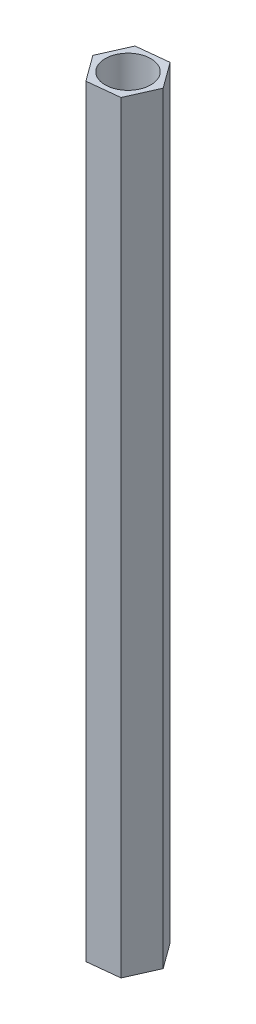
ISO-10303-21;
HEADER;
FILE_DESCRIPTION(('STEP AP214'),'2;1');
FILE_NAME('part.step','',(''),(''),'','','');
FILE_SCHEMA(('AUTOMOTIVE_DESIGN { 1 0 10303 214 1 1 1 1 }'));
ENDSEC;
DATA;
#1=APPLICATION_CONTEXT('core data for automotive mechanical design processes');
#2=APPLICATION_PROTOCOL_DEFINITION('international standard','automotive_design',2000,#1);
#3=PRODUCT_CONTEXT('',#1,'mechanical');
#4=PRODUCT('Part','Part','',(#3));
#5=PRODUCT_RELATED_PRODUCT_CATEGORY('part','',(#4));
#6=PRODUCT_DEFINITION_FORMATION('','',#4);
#7=PRODUCT_DEFINITION_CONTEXT('part definition',#1,'design');
#8=PRODUCT_DEFINITION('design','',#6,#7);
#9=PRODUCT_DEFINITION_SHAPE('','',#8);
#10=(LENGTH_UNIT() NAMED_UNIT(*) SI_UNIT(.MILLI.,.METRE.));
#11=(NAMED_UNIT(*) PLANE_ANGLE_UNIT() SI_UNIT($,.RADIAN.));
#12=(NAMED_UNIT(*) SI_UNIT($,.STERADIAN.) SOLID_ANGLE_UNIT());
#13=UNCERTAINTY_MEASURE_WITH_UNIT(LENGTH_MEASURE(1.E-05),#10,'distance_accuracy_value','');
#14=(GEOMETRIC_REPRESENTATION_CONTEXT(3) GLOBAL_UNCERTAINTY_ASSIGNED_CONTEXT((#13)) GLOBAL_UNIT_ASSIGNED_CONTEXT((#10,
#11,#12)) REPRESENTATION_CONTEXT('',''));
#15=CARTESIAN_POINT('',(0.,0.,0.));
#16=DIRECTION('',(0.,0.,1.));
#17=DIRECTION('',(1.,0.,0.));
#18=AXIS2_PLACEMENT_3D('',#15,#16,#17);
#19=CARTESIAN_POINT('',(0.,55.15,0.));
#20=DIRECTION('',(0.,1.,0.));
#21=DIRECTION('',(0.,0.,1.));
#22=AXIS2_PLACEMENT_3D('',#19,#20,#21);
#23=PLANE('',#22);
#24=DIRECTION('',(0.994280555265368,0.,-0.106799707027648));
#25=VECTOR('',#24,1.);
#26=CARTESIAN_POINT('',(-0.934496878409647,55.15,2.11188278973431));
#27=LINE('',#26,#25);
#28=CARTESIAN_POINT('',(-0.934496878409647,55.15,2.11188278973431));
#29=VERTEX_POINT('',#28);
#30=CARTESIAN_POINT('',(1.36169570652024,55.15,1.86523943132716));
#31=VERTEX_POINT('',#30);
#32=EDGE_CURVE('E129',#29,#31,#27,.T.);
#33=ORIENTED_EDGE('',*,*,#32,.T.);
#34=DIRECTION('',(0.404649018230006,0.,-0.91447207286253));
#35=VECTOR('',#34,1.);
#36=CARTESIAN_POINT('',(1.36169570652024,55.15,1.86523943132716));
#37=LINE('',#36,#35);
#38=CARTESIAN_POINT('',(2.29619258492988,55.15,-0.246643358407142));
#39=VERTEX_POINT('',#38);
#40=EDGE_CURVE('E87',#31,#39,#37,.T.);
#41=ORIENTED_EDGE('',*,*,#40,.T.);
#42=DIRECTION('',(-0.589631537035362,0.,-0.807672365834882));
#43=VECTOR('',#42,1.);
#44=CARTESIAN_POINT('',(2.29619258492988,55.15,-0.246643358407142));
#45=LINE('',#44,#43);
#46=CARTESIAN_POINT('',(0.934496878409646,55.15,-2.11188278973431));
#47=VERTEX_POINT('',#46);
#48=EDGE_CURVE('E100',#39,#47,#45,.T.);
#49=ORIENTED_EDGE('',*,*,#48,.T.);
#50=DIRECTION('',(-0.994280555265368,0.,0.106799707027648));
#51=VECTOR('',#50,1.);
#52=CARTESIAN_POINT('',(0.934496878409646,55.15,-2.11188278973431));
#53=LINE('',#52,#51);
#54=CARTESIAN_POINT('',(-1.36169570652024,55.15,-1.86523943132716));
#55=VERTEX_POINT('',#54);
#56=EDGE_CURVE('E94',#47,#55,#53,.T.);
#57=ORIENTED_EDGE('',*,*,#56,.T.);
#58=DIRECTION('',(-0.404649018230006,0.,0.91447207286253));
#59=VECTOR('',#58,1.);
#60=CARTESIAN_POINT('',(-1.36169570652024,55.15,-1.86523943132716));
#61=LINE('',#60,#59);
#62=CARTESIAN_POINT('',(-2.29619258492988,55.15,0.246643358407142));
#63=VERTEX_POINT('',#62);
#64=EDGE_CURVE('E98',#55,#63,#61,.T.);
#65=ORIENTED_EDGE('',*,*,#64,.T.);
#66=DIRECTION('',(0.589631537035362,0.,0.807672365834882));
#67=VECTOR('',#66,1.);
#68=CARTESIAN_POINT('',(-2.29619258492988,55.15,0.246643358407142));
#69=LINE('',#68,#67);
#70=EDGE_CURVE('E50',#63,#29,#69,.T.);
#71=ORIENTED_EDGE('',*,*,#70,.T.);
#72=EDGE_LOOP('',(#33,#41,#49,#57,#65,#71));
#73=FACE_BOUND('',#72,.T.);
#74=CARTESIAN_POINT('',(0.,55.15,0.));
#75=DIRECTION('',(0.,1.,0.));
#76=DIRECTION('',(0.,0.,1.));
#77=AXIS2_PLACEMENT_3D('',#74,#75,#76);
#78=CIRCLE('',#77,1.65);
#79=CARTESIAN_POINT('',(0.,55.15,1.65));
#80=VERTEX_POINT('',#79);
#81=EDGE_CURVE('E122',#80,#80,#78,.T.);
#82=ORIENTED_EDGE('',*,*,#81,.F.);
#83=EDGE_LOOP('',(#82));
#84=FACE_BOUND('',#83,.T.);
#85=ADVANCED_FACE('F33',(#73,#84),#23,.T.);
#86=CARTESIAN_POINT('',(0.,0.,0.));
#87=DIRECTION('',(0.,1.,0.));
#88=DIRECTION('',(0.,0.,1.));
#89=AXIS2_PLACEMENT_3D('',#86,#87,#88);
#90=PLANE('',#89);
#91=DIRECTION('',(0.994280555265368,0.,-0.106799707027648));
#92=VECTOR('',#91,1.);
#93=CARTESIAN_POINT('',(-0.934496878409647,0.,2.11188278973431));
#94=LINE('',#93,#92);
#95=CARTESIAN_POINT('',(-0.934496878409647,0.,2.11188278973431));
#96=VERTEX_POINT('',#95);
#97=CARTESIAN_POINT('',(1.36169570652024,0.,1.86523943132716));
#98=VERTEX_POINT('',#97);
#99=EDGE_CURVE('E118',#96,#98,#94,.T.);
#100=ORIENTED_EDGE('',*,*,#99,.F.);
#101=DIRECTION('',(0.589631537035362,0.,0.807672365834882));
#102=VECTOR('',#101,1.);
#103=CARTESIAN_POINT('',(-2.29619258492988,0.,0.246643358407142));
#104=LINE('',#103,#102);
#105=CARTESIAN_POINT('',(-2.29619258492988,0.,0.246643358407142));
#106=VERTEX_POINT('',#105);
#107=EDGE_CURVE('E79',#106,#96,#104,.T.);
#108=ORIENTED_EDGE('',*,*,#107,.F.);
#109=DIRECTION('',(-0.404649018230006,0.,0.91447207286253));
#110=VECTOR('',#109,1.);
#111=CARTESIAN_POINT('',(-1.36169570652024,0.,-1.86523943132716));
#112=LINE('',#111,#110);
#113=CARTESIAN_POINT('',(-1.36169570652024,0.,-1.86523943132716));
#114=VERTEX_POINT('',#113);
#115=EDGE_CURVE('E73',#114,#106,#112,.T.);
#116=ORIENTED_EDGE('',*,*,#115,.F.);
#117=DIRECTION('',(-0.994280555265368,0.,0.106799707027648));
#118=VECTOR('',#117,1.);
#119=CARTESIAN_POINT('',(0.934496878409646,0.,-2.11188278973431));
#120=LINE('',#119,#118);
#121=CARTESIAN_POINT('',(0.934496878409646,0.,-2.11188278973431));
#122=VERTEX_POINT('',#121);
#123=EDGE_CURVE('E108',#122,#114,#120,.T.);
#124=ORIENTED_EDGE('',*,*,#123,.F.);
#125=DIRECTION('',(-0.589631537035362,0.,-0.807672365834882));
#126=VECTOR('',#125,1.);
#127=CARTESIAN_POINT('',(2.29619258492988,0.,-0.246643358407142));
#128=LINE('',#127,#126);
#129=CARTESIAN_POINT('',(2.29619258492988,0.,-0.246643358407142));
#130=VERTEX_POINT('',#129);
#131=EDGE_CURVE('E124',#130,#122,#128,.T.);
#132=ORIENTED_EDGE('',*,*,#131,.F.);
#133=DIRECTION('',(0.404649018230006,0.,-0.91447207286253));
#134=VECTOR('',#133,1.);
#135=CARTESIAN_POINT('',(1.36169570652024,0.,1.86523943132716));
#136=LINE('',#135,#134);
#137=EDGE_CURVE('E121',#98,#130,#136,.T.);
#138=ORIENTED_EDGE('',*,*,#137,.F.);
#139=EDGE_LOOP('',(#100,#108,#116,#124,#132,#138));
#140=FACE_BOUND('',#139,.T.);
#141=CARTESIAN_POINT('',(0.,0.,0.));
#142=DIRECTION('',(0.,1.,0.));
#143=DIRECTION('',(0.,0.,1.));
#144=AXIS2_PLACEMENT_3D('',#141,#142,#143);
#145=CIRCLE('',#144,1.65);
#146=CARTESIAN_POINT('',(0.,0.,1.65));
#147=VERTEX_POINT('',#146);
#148=EDGE_CURVE('E222',#147,#147,#145,.T.);
#149=ORIENTED_EDGE('',*,*,#148,.T.);
#150=EDGE_LOOP('',(#149));
#151=FACE_BOUND('',#150,.T.);
#152=ADVANCED_FACE('F138',(#140,#151),#90,.F.);
#153=CARTESIAN_POINT('',(-0.934496878409647,55.15,2.11188278973431));
#154=DIRECTION('',(-0.106799707027648,0.,-0.994280555265368));
#155=DIRECTION('',(-0.994280555265368,0.,0.106799707027648));
#156=AXIS2_PLACEMENT_3D('',#153,#154,#155);
#157=PLANE('',#156);
#158=ORIENTED_EDGE('',*,*,#99,.T.);
#159=DIRECTION('',(0.,-1.,0.));
#160=VECTOR('',#159,1.);
#161=CARTESIAN_POINT('',(1.36169570652024,55.15,1.86523943132716));
#162=LINE('',#161,#160);
#163=EDGE_CURVE('E11',#31,#98,#162,.T.);
#164=ORIENTED_EDGE('',*,*,#163,.F.);
#165=ORIENTED_EDGE('',*,*,#32,.F.);
#166=DIRECTION('',(0.,-1.,0.));
#167=VECTOR('',#166,1.);
#168=CARTESIAN_POINT('',(-0.934496878409647,55.15,2.11188278973431));
#169=LINE('',#168,#167);
#170=EDGE_CURVE('E114',#29,#96,#169,.T.);
#171=ORIENTED_EDGE('',*,*,#170,.T.);
#172=EDGE_LOOP('',(#158,#164,#165,#171));
#173=FACE_BOUND('',#172,.T.);
#174=ADVANCED_FACE('F35',(#173),#157,.F.);
#175=CARTESIAN_POINT('',(1.36169570652024,55.15,1.86523943132716));
#176=DIRECTION('',(-0.91447207286253,0.,-0.404649018230006));
#177=DIRECTION('',(-0.404649018230006,0.,0.91447207286253));
#178=AXIS2_PLACEMENT_3D('',#175,#176,#177);
#179=PLANE('',#178);
#180=ORIENTED_EDGE('',*,*,#137,.T.);
#181=DIRECTION('',(0.,-1.,0.));
#182=VECTOR('',#181,1.);
#183=CARTESIAN_POINT('',(2.29619258492988,55.15,-0.246643358407142));
#184=LINE('',#183,#182);
#185=EDGE_CURVE('E42',#39,#130,#184,.T.);
#186=ORIENTED_EDGE('',*,*,#185,.F.);
#187=ORIENTED_EDGE('',*,*,#40,.F.);
#188=ORIENTED_EDGE('',*,*,#163,.T.);
#189=EDGE_LOOP('',(#180,#186,#187,#188));
#190=FACE_BOUND('',#189,.T.);
#191=ADVANCED_FACE('F163',(#190),#179,.F.);
#192=CARTESIAN_POINT('',(2.29619258492988,55.15,-0.246643358407142));
#193=DIRECTION('',(-0.807672365834882,0.,0.589631537035362));
#194=DIRECTION('',(0.589631537035362,0.,0.807672365834882));
#195=AXIS2_PLACEMENT_3D('',#192,#193,#194);
#196=PLANE('',#195);
#197=ORIENTED_EDGE('',*,*,#131,.T.);
#198=DIRECTION('',(0.,-1.,0.));
#199=VECTOR('',#198,1.);
#200=CARTESIAN_POINT('',(0.934496878409646,55.15,-2.11188278973431));
#201=LINE('',#200,#199);
#202=EDGE_CURVE('E109',#47,#122,#201,.T.);
#203=ORIENTED_EDGE('',*,*,#202,.F.);
#204=ORIENTED_EDGE('',*,*,#48,.F.);
#205=ORIENTED_EDGE('',*,*,#185,.T.);
#206=EDGE_LOOP('',(#197,#203,#204,#205));
#207=FACE_BOUND('',#206,.T.);
#208=ADVANCED_FACE('F135',(#207),#196,.F.);
#209=CARTESIAN_POINT('',(0.934496878409646,55.15,-2.11188278973431));
#210=DIRECTION('',(0.106799707027648,0.,0.994280555265368));
#211=DIRECTION('',(0.994280555265368,0.,-0.106799707027648));
#212=AXIS2_PLACEMENT_3D('',#209,#210,#211);
#213=PLANE('',#212);
#214=ORIENTED_EDGE('',*,*,#123,.T.);
#215=DIRECTION('',(0.,-1.,0.));
#216=VECTOR('',#215,1.);
#217=CARTESIAN_POINT('',(-1.36169570652024,55.15,-1.86523943132716));
#218=LINE('',#217,#216);
#219=EDGE_CURVE('E105',#55,#114,#218,.T.);
#220=ORIENTED_EDGE('',*,*,#219,.F.);
#221=ORIENTED_EDGE('',*,*,#56,.F.);
#222=ORIENTED_EDGE('',*,*,#202,.T.);
#223=EDGE_LOOP('',(#214,#220,#221,#222));
#224=FACE_BOUND('',#223,.T.);
#225=ADVANCED_FACE('F106',(#224),#213,.F.);
#226=CARTESIAN_POINT('',(-1.36169570652024,55.15,-1.86523943132716));
#227=DIRECTION('',(0.91447207286253,0.,0.404649018230006));
#228=DIRECTION('',(0.404649018230006,0.,-0.91447207286253));
#229=AXIS2_PLACEMENT_3D('',#226,#227,#228);
#230=PLANE('',#229);
#231=ORIENTED_EDGE('',*,*,#115,.T.);
#232=DIRECTION('',(0.,-1.,0.));
#233=VECTOR('',#232,1.);
#234=CARTESIAN_POINT('',(-2.29619258492988,55.15,0.246643358407142));
#235=LINE('',#234,#233);
#236=EDGE_CURVE('E110',#63,#106,#235,.T.);
#237=ORIENTED_EDGE('',*,*,#236,.F.);
#238=ORIENTED_EDGE('',*,*,#64,.F.);
#239=ORIENTED_EDGE('',*,*,#219,.T.);
#240=EDGE_LOOP('',(#231,#237,#238,#239));
#241=FACE_BOUND('',#240,.T.);
#242=ADVANCED_FACE('F112',(#241),#230,.F.);
#243=CARTESIAN_POINT('',(-2.29619258492988,55.15,0.246643358407142));
#244=DIRECTION('',(0.807672365834882,0.,-0.589631537035362));
#245=DIRECTION('',(-0.589631537035362,0.,-0.807672365834883));
#246=AXIS2_PLACEMENT_3D('',#243,#244,#245);
#247=PLANE('',#246);
#248=ORIENTED_EDGE('',*,*,#107,.T.);
#249=ORIENTED_EDGE('',*,*,#170,.F.);
#250=ORIENTED_EDGE('',*,*,#70,.F.);
#251=ORIENTED_EDGE('',*,*,#236,.T.);
#252=EDGE_LOOP('',(#248,#249,#250,#251));
#253=FACE_BOUND('',#252,.T.);
#254=ADVANCED_FACE('F143',(#253),#247,.F.);
#255=CARTESIAN_POINT('',(0.,55.15,0.));
#256=DIRECTION('',(0.,-1.,0.));
#257=DIRECTION('',(0.,0.,-1.));
#258=AXIS2_PLACEMENT_3D('',#255,#256,#257);
#259=CYLINDRICAL_SURFACE('',#258,1.65);
#260=ORIENTED_EDGE('',*,*,#81,.T.);
#261=EDGE_LOOP('',(#260));
#262=FACE_BOUND('',#261,.T.);
#263=ORIENTED_EDGE('',*,*,#148,.F.);
#264=EDGE_LOOP('',(#263));
#265=FACE_BOUND('',#264,.T.);
#266=ADVANCED_FACE('F145',(#262,#265),#259,.F.);
#267=CLOSED_SHELL('',(#85,#152,#174,#191,#208,#225,#242,#254,#266));
#268=MANIFOLD_SOLID_BREP('B2',#267);
#269=ADVANCED_BREP_SHAPE_REPRESENTATION('',(#18,#268),#14);
#270=SHAPE_DEFINITION_REPRESENTATION(#9,#269);
ENDSEC;
END-ISO-10303-21;
